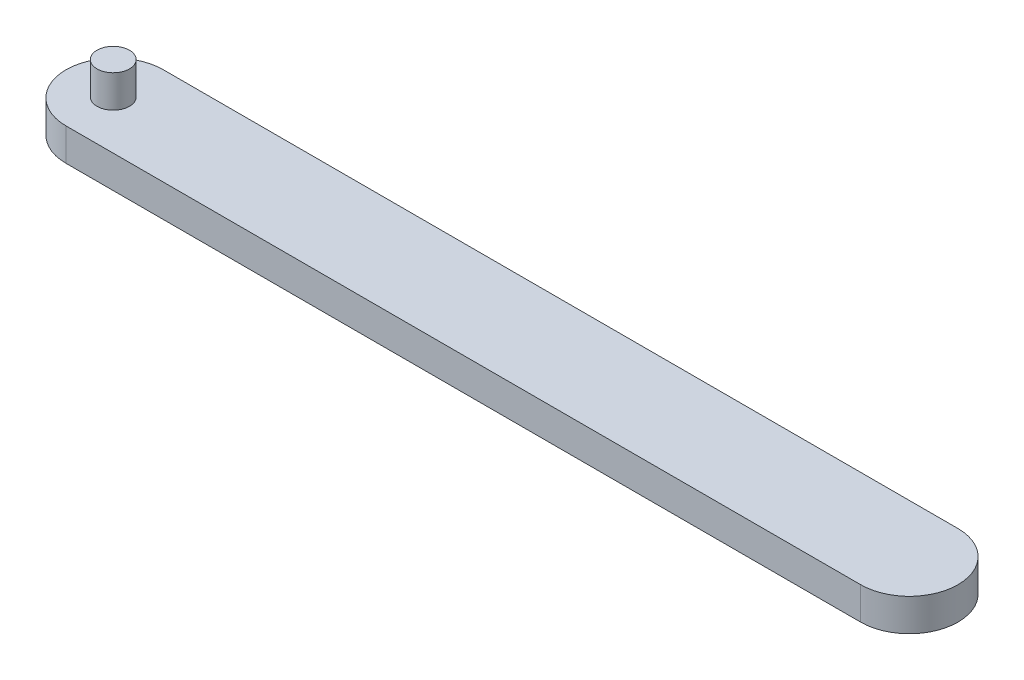
ISO-10303-21;
HEADER;
FILE_DESCRIPTION(('STEP AP214'),'2;1');
FILE_NAME('part.step','',(''),(''),'','','');
FILE_SCHEMA(('AUTOMOTIVE_DESIGN { 1 0 10303 214 1 1 1 1 }'));
ENDSEC;
DATA;
#1=APPLICATION_CONTEXT('core data for automotive mechanical design processes');
#2=APPLICATION_PROTOCOL_DEFINITION('international standard','automotive_design',2000,#1);
#3=PRODUCT_CONTEXT('',#1,'mechanical');
#4=PRODUCT('Part','Part','',(#3));
#5=PRODUCT_RELATED_PRODUCT_CATEGORY('part','',(#4));
#6=PRODUCT_DEFINITION_FORMATION('','',#4);
#7=PRODUCT_DEFINITION_CONTEXT('part definition',#1,'design');
#8=PRODUCT_DEFINITION('design','',#6,#7);
#9=PRODUCT_DEFINITION_SHAPE('','',#8);
#10=(LENGTH_UNIT() NAMED_UNIT(*) SI_UNIT(.MILLI.,.METRE.));
#11=(NAMED_UNIT(*) PLANE_ANGLE_UNIT() SI_UNIT($,.RADIAN.));
#12=(NAMED_UNIT(*) SI_UNIT($,.STERADIAN.) SOLID_ANGLE_UNIT());
#13=UNCERTAINTY_MEASURE_WITH_UNIT(LENGTH_MEASURE(1.E-05),#10,'distance_accuracy_value','');
#14=(GEOMETRIC_REPRESENTATION_CONTEXT(3) GLOBAL_UNCERTAINTY_ASSIGNED_CONTEXT((#13)) GLOBAL_UNIT_ASSIGNED_CONTEXT((#10,
#11,#12)) REPRESENTATION_CONTEXT('',''));
#15=CARTESIAN_POINT('',(0.,0.,0.));
#16=DIRECTION('',(0.,0.,1.));
#17=DIRECTION('',(1.,0.,0.));
#18=AXIS2_PLACEMENT_3D('',#15,#16,#17);
#19=CARTESIAN_POINT('',(-31.115,0.,0.));
#20=DIRECTION('',(0.,-1.,0.));
#21=DIRECTION('',(0.,0.,-1.));
#22=AXIS2_PLACEMENT_3D('',#19,#20,#21);
#23=CYLINDRICAL_SURFACE('',#22,3.81);
#24=DIRECTION('',(0.,-1.,0.));
#25=VECTOR('',#24,1.);
#26=CARTESIAN_POINT('',(-31.115,2.54,-3.81));
#27=LINE('',#26,#25);
#28=CARTESIAN_POINT('',(-31.115,0.,-3.81));
#29=VERTEX_POINT('',#28);
#30=CARTESIAN_POINT('',(-31.115,2.54,-3.81));
#31=VERTEX_POINT('',#30);
#32=EDGE_CURVE('E104',#29,#31,#27,.F.);
#33=ORIENTED_EDGE('',*,*,#32,.F.);
#34=CARTESIAN_POINT('',(-31.115,0.,0.));
#35=DIRECTION('',(0.,1.,0.));
#36=DIRECTION('',(0.,0.,1.));
#37=AXIS2_PLACEMENT_3D('',#34,#35,#36);
#38=CIRCLE('',#37,3.81);
#39=CARTESIAN_POINT('',(-31.115,0.,3.81));
#40=VERTEX_POINT('',#39);
#41=EDGE_CURVE('E43',#40,#29,#38,.F.);
#42=ORIENTED_EDGE('',*,*,#41,.F.);
#43=DIRECTION('',(0.,-1.,0.));
#44=VECTOR('',#43,1.);
#45=CARTESIAN_POINT('',(-31.115,2.54,3.81));
#46=LINE('',#45,#44);
#47=CARTESIAN_POINT('',(-31.115,2.54,3.81));
#48=VERTEX_POINT('',#47);
#49=EDGE_CURVE('E79',#48,#40,#46,.T.);
#50=ORIENTED_EDGE('',*,*,#49,.F.);
#51=CARTESIAN_POINT('',(-31.115,2.54,0.));
#52=DIRECTION('',(0.,1.,0.));
#53=DIRECTION('',(0.,0.,1.));
#54=AXIS2_PLACEMENT_3D('',#51,#52,#53);
#55=CIRCLE('',#54,3.81);
#56=EDGE_CURVE('E11',#31,#48,#55,.T.);
#57=ORIENTED_EDGE('',*,*,#56,.F.);
#58=EDGE_LOOP('',(#33,#42,#50,#57));
#59=FACE_BOUND('',#58,.T.);
#60=ADVANCED_FACE('F35',(#59),#23,.T.);
#61=CARTESIAN_POINT('',(31.115,0.,0.));
#62=DIRECTION('',(0.,-1.,0.));
#63=DIRECTION('',(0.,0.,-1.));
#64=AXIS2_PLACEMENT_3D('',#61,#62,#63);
#65=CYLINDRICAL_SURFACE('',#64,3.81);
#66=DIRECTION('',(0.,-1.,0.));
#67=VECTOR('',#66,1.);
#68=CARTESIAN_POINT('',(31.115,2.54,3.81));
#69=LINE('',#68,#67);
#70=CARTESIAN_POINT('',(31.115,0.,3.81));
#71=VERTEX_POINT('',#70);
#72=CARTESIAN_POINT('',(31.115,2.54,3.81));
#73=VERTEX_POINT('',#72);
#74=EDGE_CURVE('E78',#71,#73,#69,.F.);
#75=ORIENTED_EDGE('',*,*,#74,.F.);
#76=CARTESIAN_POINT('',(31.115,0.,0.));
#77=DIRECTION('',(0.,1.,0.));
#78=DIRECTION('',(0.,0.,1.));
#79=AXIS2_PLACEMENT_3D('',#76,#77,#78);
#80=CIRCLE('',#79,3.81);
#81=CARTESIAN_POINT('',(31.115,0.,-3.81));
#82=VERTEX_POINT('',#81);
#83=EDGE_CURVE('E85',#82,#71,#80,.F.);
#84=ORIENTED_EDGE('',*,*,#83,.F.);
#85=DIRECTION('',(0.,-1.,0.));
#86=VECTOR('',#85,1.);
#87=CARTESIAN_POINT('',(31.115,2.54,-3.81));
#88=LINE('',#87,#86);
#89=CARTESIAN_POINT('',(31.115,2.54,-3.81));
#90=VERTEX_POINT('',#89);
#91=EDGE_CURVE('E92',#90,#82,#88,.T.);
#92=ORIENTED_EDGE('',*,*,#91,.F.);
#93=CARTESIAN_POINT('',(31.115,2.54,0.));
#94=DIRECTION('',(0.,1.,0.));
#95=DIRECTION('',(0.,0.,1.));
#96=AXIS2_PLACEMENT_3D('',#93,#94,#95);
#97=CIRCLE('',#96,3.81);
#98=EDGE_CURVE('E91',#73,#90,#97,.T.);
#99=ORIENTED_EDGE('',*,*,#98,.F.);
#100=EDGE_LOOP('',(#75,#84,#92,#99));
#101=FACE_BOUND('',#100,.T.);
#102=ADVANCED_FACE('F95',(#101),#65,.T.);
#103=CARTESIAN_POINT('',(34.925,2.54,3.80999999999999));
#104=DIRECTION('',(0.,0.,-1.));
#105=DIRECTION('',(-1.,0.,0.));
#106=AXIS2_PLACEMENT_3D('',#103,#104,#105);
#107=PLANE('',#106);
#108=DIRECTION('',(1.,0.,0.));
#109=VECTOR('',#108,1.);
#110=CARTESIAN_POINT('',(34.925,2.54,3.80999999999999));
#111=LINE('',#110,#109);
#112=EDGE_CURVE('E99',#48,#73,#111,.T.);
#113=ORIENTED_EDGE('',*,*,#112,.F.);
#114=ORIENTED_EDGE('',*,*,#49,.T.);
#115=DIRECTION('',(1.,0.,0.));
#116=VECTOR('',#115,1.);
#117=CARTESIAN_POINT('',(34.925,0.,3.80999999999999));
#118=LINE('',#117,#116);
#119=EDGE_CURVE('E73',#40,#71,#118,.T.);
#120=ORIENTED_EDGE('',*,*,#119,.T.);
#121=ORIENTED_EDGE('',*,*,#74,.T.);
#122=EDGE_LOOP('',(#113,#114,#120,#121));
#123=FACE_BOUND('',#122,.T.);
#124=ADVANCED_FACE('F76',(#123),#107,.F.);
#125=CARTESIAN_POINT('',(34.925,2.54,-3.81));
#126=DIRECTION('',(0.,0.,1.));
#127=DIRECTION('',(1.,0.,0.));
#128=AXIS2_PLACEMENT_3D('',#125,#126,#127);
#129=PLANE('',#128);
#130=DIRECTION('',(-1.,0.,0.));
#131=VECTOR('',#130,1.);
#132=CARTESIAN_POINT('',(34.925,0.,-3.81));
#133=LINE('',#132,#131);
#134=EDGE_CURVE('E81',#82,#29,#133,.T.);
#135=ORIENTED_EDGE('',*,*,#134,.T.);
#136=ORIENTED_EDGE('',*,*,#32,.T.);
#137=DIRECTION('',(-1.,0.,0.));
#138=VECTOR('',#137,1.);
#139=CARTESIAN_POINT('',(34.925,2.54,-3.81));
#140=LINE('',#139,#138);
#141=EDGE_CURVE('E96',#90,#31,#140,.T.);
#142=ORIENTED_EDGE('',*,*,#141,.F.);
#143=ORIENTED_EDGE('',*,*,#91,.T.);
#144=EDGE_LOOP('',(#135,#136,#142,#143));
#145=FACE_BOUND('',#144,.T.);
#146=ADVANCED_FACE('F109',(#145),#129,.F.);
#147=CARTESIAN_POINT('',(0.,2.54,0.));
#148=DIRECTION('',(0.,1.,0.));
#149=DIRECTION('',(0.,0.,1.));
#150=AXIS2_PLACEMENT_3D('',#147,#148,#149);
#151=PLANE('',#150);
#152=CARTESIAN_POINT('',(-31.2277475733822,2.54,0.));
#153=DIRECTION('',(0.,1.,0.));
#154=DIRECTION('',(0.,0.,1.));
#155=AXIS2_PLACEMENT_3D('',#152,#153,#154);
#156=CIRCLE('',#155,1.27);
#157=CARTESIAN_POINT('',(-31.2277475733822,2.54,1.27));
#158=VERTEX_POINT('',#157);
#159=EDGE_CURVE('E112',#158,#158,#156,.T.);
#160=ORIENTED_EDGE('',*,*,#159,.F.);
#161=EDGE_LOOP('',(#160));
#162=FACE_BOUND('',#161,.T.);
#163=ORIENTED_EDGE('',*,*,#141,.T.);
#164=ORIENTED_EDGE('',*,*,#56,.T.);
#165=ORIENTED_EDGE('',*,*,#112,.T.);
#166=ORIENTED_EDGE('',*,*,#98,.T.);
#167=EDGE_LOOP('',(#163,#164,#165,#166));
#168=FACE_BOUND('',#167,.T.);
#169=ADVANCED_FACE('F126',(#162,#168),#151,.T.);
#170=CARTESIAN_POINT('',(0.,0.,0.));
#171=DIRECTION('',(0.,1.,0.));
#172=DIRECTION('',(0.,0.,1.));
#173=AXIS2_PLACEMENT_3D('',#170,#171,#172);
#174=PLANE('',#173);
#175=ORIENTED_EDGE('',*,*,#119,.F.);
#176=ORIENTED_EDGE('',*,*,#41,.T.);
#177=ORIENTED_EDGE('',*,*,#134,.F.);
#178=ORIENTED_EDGE('',*,*,#83,.T.);
#179=EDGE_LOOP('',(#175,#176,#177,#178));
#180=FACE_BOUND('',#179,.T.);
#181=ADVANCED_FACE('F86',(#180),#174,.F.);
#182=CARTESIAN_POINT('',(-31.2277475733822,5.08,0.));
#183=DIRECTION('',(0.,-1.,0.));
#184=DIRECTION('',(0.,0.,-1.));
#185=AXIS2_PLACEMENT_3D('',#182,#183,#184);
#186=CYLINDRICAL_SURFACE('',#185,1.27);
#187=CARTESIAN_POINT('',(-31.2277475733822,5.08,0.));
#188=DIRECTION('',(0.,1.,0.));
#189=DIRECTION('',(0.,0.,1.));
#190=AXIS2_PLACEMENT_3D('',#187,#188,#189);
#191=CIRCLE('',#190,1.27);
#192=CARTESIAN_POINT('',(-31.2277475733822,5.08,1.27));
#193=VERTEX_POINT('',#192);
#194=EDGE_CURVE('E82',#193,#193,#191,.T.);
#195=ORIENTED_EDGE('',*,*,#194,.F.);
#196=EDGE_LOOP('',(#195));
#197=FACE_BOUND('',#196,.T.);
#198=ORIENTED_EDGE('',*,*,#159,.T.);
#199=EDGE_LOOP('',(#198));
#200=FACE_BOUND('',#199,.T.);
#201=ADVANCED_FACE('F120',(#197,#200),#186,.T.);
#202=CARTESIAN_POINT('',(-31.2277475733822,5.08,0.));
#203=DIRECTION('',(0.,1.,0.));
#204=DIRECTION('',(0.,0.,1.));
#205=AXIS2_PLACEMENT_3D('',#202,#203,#204);
#206=PLANE('',#205);
#207=ORIENTED_EDGE('',*,*,#194,.T.);
#208=EDGE_LOOP('',(#207));
#209=FACE_BOUND('',#208,.T.);
#210=ADVANCED_FACE('F118',(#209),#206,.T.);
#211=CLOSED_SHELL('',(#60,#102,#124,#146,#169,#181,#201,#210));
#212=MANIFOLD_SOLID_BREP('B2',#211);
#213=ADVANCED_BREP_SHAPE_REPRESENTATION('',(#18,#212),#14);
#214=SHAPE_DEFINITION_REPRESENTATION(#9,#213);
ENDSEC;
END-ISO-10303-21;
